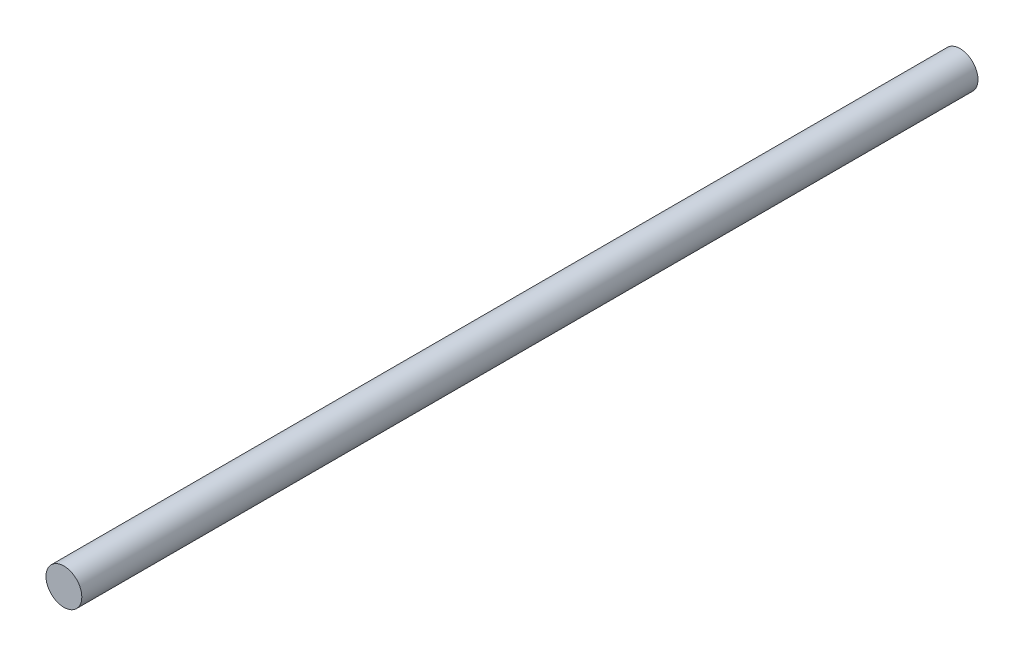
ISO-10303-21;
HEADER;
FILE_DESCRIPTION(('STEP AP214'),'2;1');
FILE_NAME('part.step','',(''),(''),'','','');
FILE_SCHEMA(('AUTOMOTIVE_DESIGN { 1 0 10303 214 1 1 1 1 }'));
ENDSEC;
DATA;
#1=APPLICATION_CONTEXT('core data for automotive mechanical design processes');
#2=APPLICATION_PROTOCOL_DEFINITION('international standard','automotive_design',2000,#1);
#3=PRODUCT_CONTEXT('',#1,'mechanical');
#4=PRODUCT('Part','Part','',(#3));
#5=PRODUCT_RELATED_PRODUCT_CATEGORY('part','',(#4));
#6=PRODUCT_DEFINITION_FORMATION('','',#4);
#7=PRODUCT_DEFINITION_CONTEXT('part definition',#1,'design');
#8=PRODUCT_DEFINITION('design','',#6,#7);
#9=PRODUCT_DEFINITION_SHAPE('','',#8);
#10=(LENGTH_UNIT() NAMED_UNIT(*) SI_UNIT(.MILLI.,.METRE.));
#11=(NAMED_UNIT(*) PLANE_ANGLE_UNIT() SI_UNIT($,.RADIAN.));
#12=(NAMED_UNIT(*) SI_UNIT($,.STERADIAN.) SOLID_ANGLE_UNIT());
#13=UNCERTAINTY_MEASURE_WITH_UNIT(LENGTH_MEASURE(1.E-05),#10,'distance_accuracy_value','');
#14=(GEOMETRIC_REPRESENTATION_CONTEXT(3) GLOBAL_UNCERTAINTY_ASSIGNED_CONTEXT((#13)) GLOBAL_UNIT_ASSIGNED_CONTEXT((#10,
#11,#12)) REPRESENTATION_CONTEXT('',''));
#15=CARTESIAN_POINT('',(0.,0.,0.));
#16=DIRECTION('',(0.,0.,1.));
#17=DIRECTION('',(1.,0.,0.));
#18=AXIS2_PLACEMENT_3D('',#15,#16,#17);
#19=CARTESIAN_POINT('',(0.,0.,25.4));
#20=DIRECTION('',(0.,0.,-1.));
#21=DIRECTION('',(-1.,0.,0.));
#22=AXIS2_PLACEMENT_3D('',#19,#20,#21);
#23=CYLINDRICAL_SURFACE('',#22,0.508);
#24=CARTESIAN_POINT('',(0.,0.,25.4));
#25=DIRECTION('',(0.,0.,1.));
#26=DIRECTION('',(1.,0.,0.));
#27=AXIS2_PLACEMENT_3D('',#24,#25,#26);
#28=CIRCLE('',#27,0.508);
#29=CARTESIAN_POINT('',(0.508,0.,25.4));
#30=VERTEX_POINT('',#29);
#31=EDGE_CURVE('E10',#30,#30,#28,.T.);
#32=ORIENTED_EDGE('',*,*,#31,.F.);
#33=EDGE_LOOP('',(#32));
#34=FACE_BOUND('',#33,.T.);
#35=CARTESIAN_POINT('',(0.,0.,0.));
#36=DIRECTION('',(0.,0.,1.));
#37=DIRECTION('',(1.,0.,0.));
#38=AXIS2_PLACEMENT_3D('',#35,#36,#37);
#39=CIRCLE('',#38,0.508);
#40=CARTESIAN_POINT('',(0.508,0.,0.));
#41=VERTEX_POINT('',#40);
#42=EDGE_CURVE('E33',#41,#41,#39,.T.);
#43=ORIENTED_EDGE('',*,*,#42,.T.);
#44=EDGE_LOOP('',(#43));
#45=FACE_BOUND('',#44,.T.);
#46=ADVANCED_FACE('F30',(#34,#45),#23,.T.);
#47=CARTESIAN_POINT('',(0.,0.,25.4));
#48=DIRECTION('',(0.,0.,1.));
#49=DIRECTION('',(1.,0.,0.));
#50=AXIS2_PLACEMENT_3D('',#47,#48,#49);
#51=PLANE('',#50);
#52=ORIENTED_EDGE('',*,*,#31,.T.);
#53=EDGE_LOOP('',(#52));
#54=FACE_BOUND('',#53,.T.);
#55=ADVANCED_FACE('F45',(#54),#51,.T.);
#56=CARTESIAN_POINT('',(0.,0.,0.));
#57=DIRECTION('',(0.,0.,1.));
#58=DIRECTION('',(1.,0.,0.));
#59=AXIS2_PLACEMENT_3D('',#56,#57,#58);
#60=PLANE('',#59);
#61=ORIENTED_EDGE('',*,*,#42,.F.);
#62=EDGE_LOOP('',(#61));
#63=FACE_BOUND('',#62,.T.);
#64=ADVANCED_FACE('F43',(#63),#60,.F.);
#65=CLOSED_SHELL('',(#46,#55,#64));
#66=MANIFOLD_SOLID_BREP('B2',#65);
#67=ADVANCED_BREP_SHAPE_REPRESENTATION('',(#18,#66),#14);
#68=SHAPE_DEFINITION_REPRESENTATION(#9,#67);
ENDSEC;
END-ISO-10303-21;
